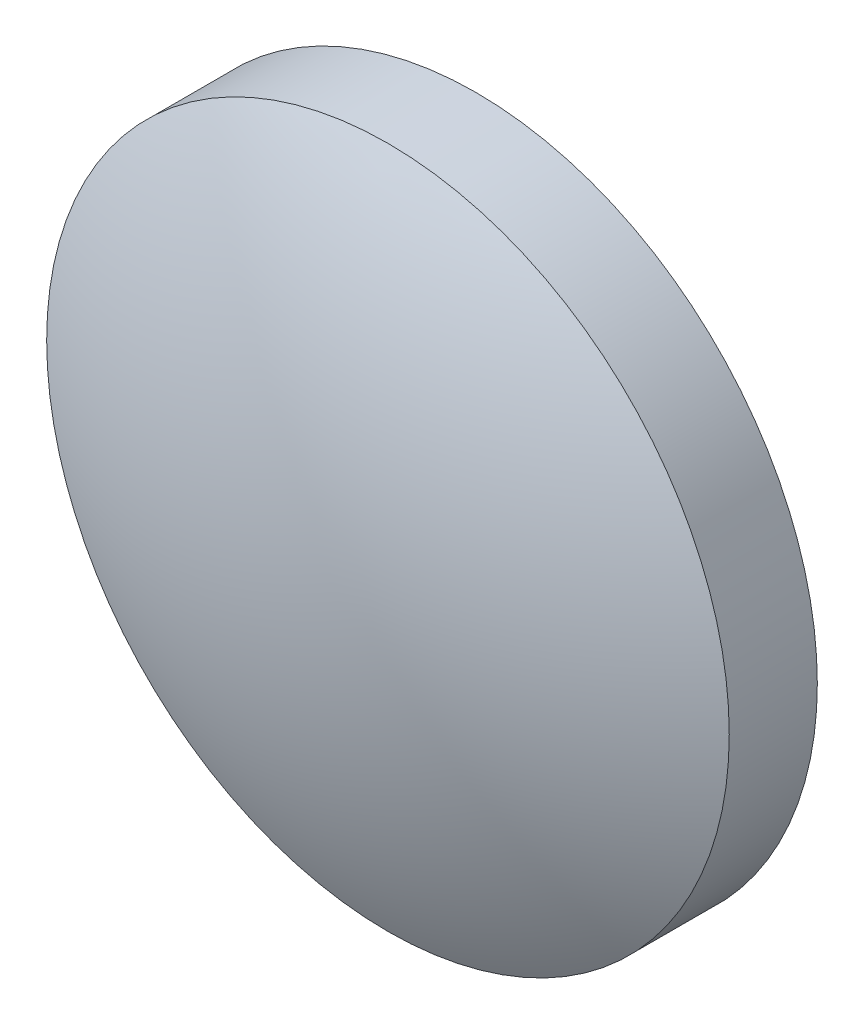
ISO-10303-21;
HEADER;
FILE_DESCRIPTION(('STEP AP214'),'2;1');
FILE_NAME('part.step','',(''),(''),'','','');
FILE_SCHEMA(('AUTOMOTIVE_DESIGN { 1 0 10303 214 1 1 1 1 }'));
ENDSEC;
DATA;
#1=APPLICATION_CONTEXT('core data for automotive mechanical design processes');
#2=APPLICATION_PROTOCOL_DEFINITION('international standard','automotive_design',2000,#1);
#3=PRODUCT_CONTEXT('',#1,'mechanical');
#4=PRODUCT('Part','Part','',(#3));
#5=PRODUCT_RELATED_PRODUCT_CATEGORY('part','',(#4));
#6=PRODUCT_DEFINITION_FORMATION('','',#4);
#7=PRODUCT_DEFINITION_CONTEXT('part definition',#1,'design');
#8=PRODUCT_DEFINITION('design','',#6,#7);
#9=PRODUCT_DEFINITION_SHAPE('','',#8);
#10=(LENGTH_UNIT() NAMED_UNIT(*) SI_UNIT(.MILLI.,.METRE.));
#11=(NAMED_UNIT(*) PLANE_ANGLE_UNIT() SI_UNIT($,.RADIAN.));
#12=(NAMED_UNIT(*) SI_UNIT($,.STERADIAN.) SOLID_ANGLE_UNIT());
#13=UNCERTAINTY_MEASURE_WITH_UNIT(LENGTH_MEASURE(1.E-05),#10,'distance_accuracy_value','');
#14=(GEOMETRIC_REPRESENTATION_CONTEXT(3) GLOBAL_UNCERTAINTY_ASSIGNED_CONTEXT((#13)) GLOBAL_UNIT_ASSIGNED_CONTEXT((#10,
#11,#12)) REPRESENTATION_CONTEXT('',''));
#15=CARTESIAN_POINT('',(0.,0.,0.));
#16=DIRECTION('',(0.,0.,1.));
#17=DIRECTION('',(1.,0.,0.));
#18=AXIS2_PLACEMENT_3D('',#15,#16,#17);
#19=CARTESIAN_POINT('',(0.,0.,6.99223598133428));
#20=DIRECTION('',(0.,0.,-1.));
#21=DIRECTION('',(0.,-1.,0.));
#22=AXIS2_PLACEMENT_3D('',#19,#20,#21);
#23=SPHERICAL_SURFACE('',#22,8.435);
#24=CARTESIAN_POINT('',(0.,0.,-0.5));
#25=DIRECTION('',(0.,0.,-1.));
#26=DIRECTION('',(0.,1.,0.));
#27=AXIS2_PLACEMENT_3D('',#24,#25,#26);
#28=CIRCLE('',#27,3.875);
#29=CARTESIAN_POINT('',(0.,3.875,-0.5));
#30=VERTEX_POINT('',#29);
#31=EDGE_CURVE('E10',#30,#30,#28,.T.);
#32=ORIENTED_EDGE('',*,*,#31,.T.);
#33=EDGE_LOOP('',(#32));
#34=FACE_BOUND('',#33,.T.);
#35=ADVANCED_FACE('F43',(#34),#23,.T.);
#36=CARTESIAN_POINT('',(0.,0.,0.));
#37=DIRECTION('',(0.,0.,-1.));
#38=DIRECTION('',(0.,1.,0.));
#39=AXIS2_PLACEMENT_3D('',#36,#37,#38);
#40=CYLINDRICAL_SURFACE('',#39,3.875);
#41=ORIENTED_EDGE('',*,*,#31,.F.);
#42=EDGE_LOOP('',(#41));
#43=FACE_BOUND('',#42,.T.);
#44=CARTESIAN_POINT('',(0.,0.,0.5));
#45=DIRECTION('',(0.,0.,-1.));
#46=DIRECTION('',(0.,1.,0.));
#47=AXIS2_PLACEMENT_3D('',#44,#45,#46);
#48=CIRCLE('',#47,3.875);
#49=CARTESIAN_POINT('',(0.,3.875,0.5));
#50=VERTEX_POINT('',#49);
#51=EDGE_CURVE('E50',#50,#50,#48,.T.);
#52=ORIENTED_EDGE('',*,*,#51,.T.);
#53=EDGE_LOOP('',(#52));
#54=FACE_BOUND('',#53,.T.);
#55=ADVANCED_FACE('F57',(#43,#54),#40,.T.);
#56=CARTESIAN_POINT('',(0.,0.,-6.99223598133428));
#57=DIRECTION('',(0.,0.,-1.));
#58=DIRECTION('',(0.,1.,0.));
#59=AXIS2_PLACEMENT_3D('',#56,#57,#58);
#60=SPHERICAL_SURFACE('',#59,8.435);
#61=ORIENTED_EDGE('',*,*,#51,.F.);
#62=EDGE_LOOP('',(#61));
#63=FACE_BOUND('',#62,.T.);
#64=ADVANCED_FACE('F59',(#63),#60,.T.);
#65=CLOSED_SHELL('',(#35,#55,#64));
#66=MANIFOLD_SOLID_BREP('B2',#65);
#67=ADVANCED_BREP_SHAPE_REPRESENTATION('',(#18,#66),#14);
#68=SHAPE_DEFINITION_REPRESENTATION(#9,#67);
ENDSEC;
END-ISO-10303-21;
